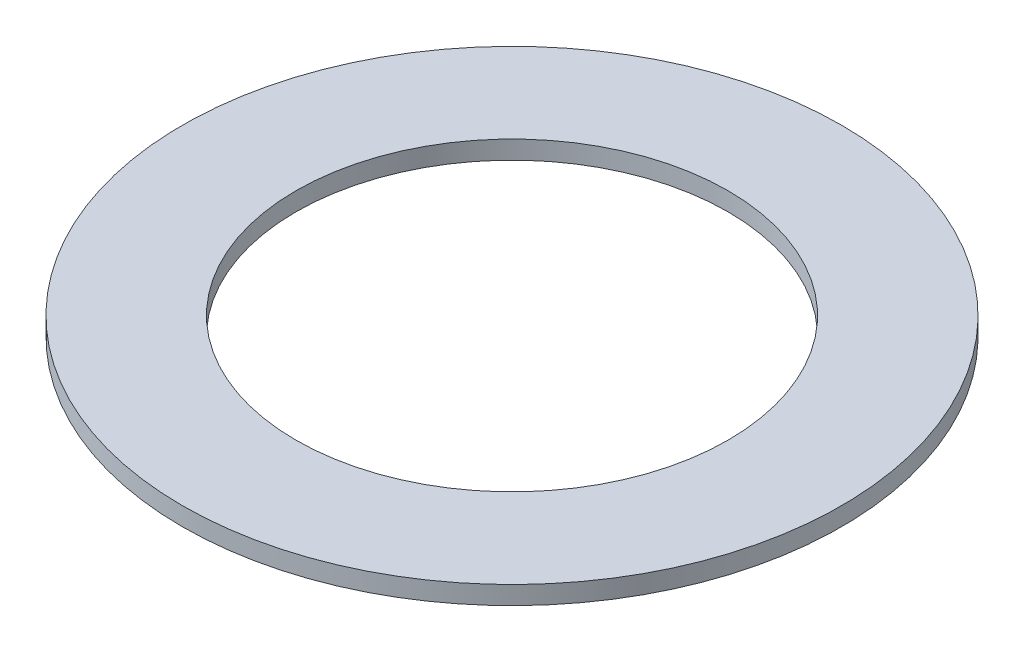
ISO-10303-21;
HEADER;
FILE_DESCRIPTION(('STEP AP214'),'2;1');
FILE_NAME('part.step','',(''),(''),'','','');
FILE_SCHEMA(('AUTOMOTIVE_DESIGN { 1 0 10303 214 1 1 1 1 }'));
ENDSEC;
DATA;
#1=APPLICATION_CONTEXT('core data for automotive mechanical design processes');
#2=APPLICATION_PROTOCOL_DEFINITION('international standard','automotive_design',2000,#1);
#3=PRODUCT_CONTEXT('',#1,'mechanical');
#4=PRODUCT('Part','Part','',(#3));
#5=PRODUCT_RELATED_PRODUCT_CATEGORY('part','',(#4));
#6=PRODUCT_DEFINITION_FORMATION('','',#4);
#7=PRODUCT_DEFINITION_CONTEXT('part definition',#1,'design');
#8=PRODUCT_DEFINITION('design','',#6,#7);
#9=PRODUCT_DEFINITION_SHAPE('','',#8);
#10=(LENGTH_UNIT() NAMED_UNIT(*) SI_UNIT(.MILLI.,.METRE.));
#11=(NAMED_UNIT(*) PLANE_ANGLE_UNIT() SI_UNIT($,.RADIAN.));
#12=(NAMED_UNIT(*) SI_UNIT($,.STERADIAN.) SOLID_ANGLE_UNIT());
#13=UNCERTAINTY_MEASURE_WITH_UNIT(LENGTH_MEASURE(1.E-05),#10,'distance_accuracy_value','');
#14=(GEOMETRIC_REPRESENTATION_CONTEXT(3) GLOBAL_UNCERTAINTY_ASSIGNED_CONTEXT((#13)) GLOBAL_UNIT_ASSIGNED_CONTEXT((#10,
#11,#12)) REPRESENTATION_CONTEXT('',''));
#15=CARTESIAN_POINT('',(0.,0.,0.));
#16=DIRECTION('',(0.,0.,1.));
#17=DIRECTION('',(1.,0.,0.));
#18=AXIS2_PLACEMENT_3D('',#15,#16,#17);
#19=CARTESIAN_POINT('',(0.,0.5,0.));
#20=DIRECTION('',(0.,1.,0.));
#21=DIRECTION('',(0.,0.,1.));
#22=AXIS2_PLACEMENT_3D('',#19,#20,#21);
#23=PLANE('',#22);
#24=CARTESIAN_POINT('',(0.,0.5,0.));
#25=DIRECTION('',(0.,1.,0.));
#26=DIRECTION('',(0.,0.,1.));
#27=AXIS2_PLACEMENT_3D('',#24,#25,#26);
#28=CIRCLE('',#27,8.99999999999999);
#29=CARTESIAN_POINT('',(0.,0.5,8.99999999999999));
#30=VERTEX_POINT('',#29);
#31=EDGE_CURVE('E10',#30,#30,#28,.T.);
#32=ORIENTED_EDGE('',*,*,#31,.T.);
#33=EDGE_LOOP('',(#32));
#34=FACE_BOUND('',#33,.T.);
#35=CARTESIAN_POINT('',(0.,0.5,0.));
#36=DIRECTION('',(0.,1.,0.));
#37=DIRECTION('',(0.,0.,1.));
#38=AXIS2_PLACEMENT_3D('',#35,#36,#37);
#39=CIRCLE('',#38,5.9);
#40=CARTESIAN_POINT('',(0.,0.5,5.9));
#41=VERTEX_POINT('',#40);
#42=EDGE_CURVE('E48',#41,#41,#39,.T.);
#43=ORIENTED_EDGE('',*,*,#42,.F.);
#44=EDGE_LOOP('',(#43));
#45=FACE_BOUND('',#44,.T.);
#46=ADVANCED_FACE('F37',(#34,#45),#23,.T.);
#47=CARTESIAN_POINT('',(0.,0.,0.));
#48=DIRECTION('',(0.,1.,0.));
#49=DIRECTION('',(0.,0.,1.));
#50=AXIS2_PLACEMENT_3D('',#47,#48,#49);
#51=PLANE('',#50);
#52=CARTESIAN_POINT('',(0.,0.,0.));
#53=DIRECTION('',(0.,1.,0.));
#54=DIRECTION('',(0.,0.,1.));
#55=AXIS2_PLACEMENT_3D('',#52,#53,#54);
#56=CIRCLE('',#55,8.99999999999999);
#57=CARTESIAN_POINT('',(0.,0.,8.99999999999999));
#58=VERTEX_POINT('',#57);
#59=EDGE_CURVE('E41',#58,#58,#56,.T.);
#60=ORIENTED_EDGE('',*,*,#59,.F.);
#61=EDGE_LOOP('',(#60));
#62=FACE_BOUND('',#61,.T.);
#63=CARTESIAN_POINT('',(0.,0.,0.));
#64=DIRECTION('',(0.,1.,0.));
#65=DIRECTION('',(0.,0.,1.));
#66=AXIS2_PLACEMENT_3D('',#63,#64,#65);
#67=CIRCLE('',#66,5.9);
#68=CARTESIAN_POINT('',(0.,0.,5.9));
#69=VERTEX_POINT('',#68);
#70=EDGE_CURVE('E50',#69,#69,#67,.T.);
#71=ORIENTED_EDGE('',*,*,#70,.T.);
#72=EDGE_LOOP('',(#71));
#73=FACE_BOUND('',#72,.T.);
#74=ADVANCED_FACE('F60',(#62,#73),#51,.F.);
#75=CARTESIAN_POINT('',(0.,0.5,0.));
#76=DIRECTION('',(0.,-1.,0.));
#77=DIRECTION('',(0.,0.,-1.));
#78=AXIS2_PLACEMENT_3D('',#75,#76,#77);
#79=CYLINDRICAL_SURFACE('',#78,8.99999999999999);
#80=ORIENTED_EDGE('',*,*,#31,.F.);
#81=EDGE_LOOP('',(#80));
#82=FACE_BOUND('',#81,.T.);
#83=ORIENTED_EDGE('',*,*,#59,.T.);
#84=EDGE_LOOP('',(#83));
#85=FACE_BOUND('',#84,.T.);
#86=ADVANCED_FACE('F39',(#82,#85),#79,.T.);
#87=CARTESIAN_POINT('',(0.,0.5,0.));
#88=DIRECTION('',(0.,-1.,0.));
#89=DIRECTION('',(0.,0.,-1.));
#90=AXIS2_PLACEMENT_3D('',#87,#88,#89);
#91=CYLINDRICAL_SURFACE('',#90,5.9);
#92=ORIENTED_EDGE('',*,*,#42,.T.);
#93=EDGE_LOOP('',(#92));
#94=FACE_BOUND('',#93,.T.);
#95=ORIENTED_EDGE('',*,*,#70,.F.);
#96=EDGE_LOOP('',(#95));
#97=FACE_BOUND('',#96,.T.);
#98=ADVANCED_FACE('F56',(#94,#97),#91,.F.);
#99=CLOSED_SHELL('',(#46,#74,#86,#98));
#100=MANIFOLD_SOLID_BREP('B2',#99);
#101=ADVANCED_BREP_SHAPE_REPRESENTATION('',(#18,#100),#14);
#102=SHAPE_DEFINITION_REPRESENTATION(#9,#101);
ENDSEC;
END-ISO-10303-21;
